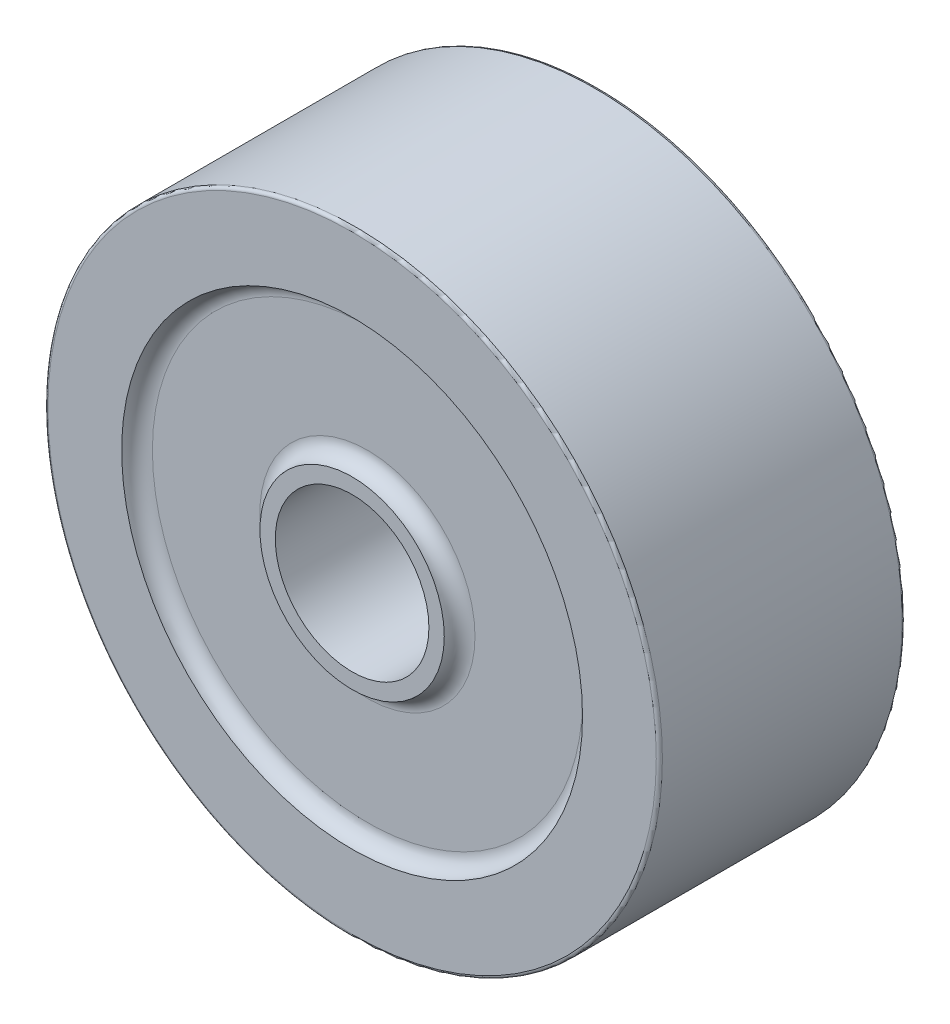
ISO-10303-21;
HEADER;
FILE_DESCRIPTION(('STEP AP214'),'2;1');
FILE_NAME('part.step','',(''),(''),'','','');
FILE_SCHEMA(('AUTOMOTIVE_DESIGN { 1 0 10303 214 1 1 1 1 }'));
ENDSEC;
DATA;
#1=APPLICATION_CONTEXT('core data for automotive mechanical design processes');
#2=APPLICATION_PROTOCOL_DEFINITION('international standard','automotive_design',2000,#1);
#3=PRODUCT_CONTEXT('',#1,'mechanical');
#4=PRODUCT('Part','Part','',(#3));
#5=PRODUCT_RELATED_PRODUCT_CATEGORY('part','',(#4));
#6=PRODUCT_DEFINITION_FORMATION('','',#4);
#7=PRODUCT_DEFINITION_CONTEXT('part definition',#1,'design');
#8=PRODUCT_DEFINITION('design','',#6,#7);
#9=PRODUCT_DEFINITION_SHAPE('','',#8);
#10=(LENGTH_UNIT() NAMED_UNIT(*) SI_UNIT(.MILLI.,.METRE.));
#11=(NAMED_UNIT(*) PLANE_ANGLE_UNIT() SI_UNIT($,.RADIAN.));
#12=(NAMED_UNIT(*) SI_UNIT($,.STERADIAN.) SOLID_ANGLE_UNIT());
#13=UNCERTAINTY_MEASURE_WITH_UNIT(LENGTH_MEASURE(1.E-05),#10,'distance_accuracy_value','');
#14=(GEOMETRIC_REPRESENTATION_CONTEXT(3) GLOBAL_UNCERTAINTY_ASSIGNED_CONTEXT((#13)) GLOBAL_UNIT_ASSIGNED_CONTEXT((#10,
#11,#12)) REPRESENTATION_CONTEXT('',''));
#15=CARTESIAN_POINT('',(0.,0.,0.));
#16=DIRECTION('',(0.,0.,1.));
#17=DIRECTION('',(1.,0.,0.));
#18=AXIS2_PLACEMENT_3D('',#15,#16,#17);
#19=CARTESIAN_POINT('',(0.,0.,0.));
#20=DIRECTION('',(0.,0.,1.));
#21=DIRECTION('',(1.,0.,0.));
#22=AXIS2_PLACEMENT_3D('',#19,#20,#21);
#23=PLANE('',#22);
#24=CARTESIAN_POINT('',(0.,0.,0.));
#25=DIRECTION('',(0.,0.,1.));
#26=DIRECTION('',(1.,0.,0.));
#27=AXIS2_PLACEMENT_3D('',#24,#25,#26);
#28=CIRCLE('',#27,6.35);
#29=CARTESIAN_POINT('',(6.35,0.,0.));
#30=VERTEX_POINT('',#29);
#31=EDGE_CURVE('E127',#30,#30,#28,.T.);
#32=ORIENTED_EDGE('',*,*,#31,.F.);
#33=EDGE_LOOP('',(#32));
#34=FACE_BOUND('',#33,.T.);
#35=CARTESIAN_POINT('',(0.,0.,0.));
#36=DIRECTION('',(0.,0.,1.));
#37=DIRECTION('',(1.,0.,0.));
#38=AXIS2_PLACEMENT_3D('',#35,#36,#37);
#39=CIRCLE('',#38,7.62);
#40=CARTESIAN_POINT('',(7.62,0.,0.));
#41=VERTEX_POINT('',#40);
#42=EDGE_CURVE('E144',#41,#41,#39,.T.);
#43=ORIENTED_EDGE('',*,*,#42,.T.);
#44=EDGE_LOOP('',(#43));
#45=FACE_BOUND('',#44,.T.);
#46=ADVANCED_FACE('F34',(#34,#45),#23,.T.);
#47=CARTESIAN_POINT('',(0.,-7.62,-1.27));
#48=DIRECTION('',(0.,0.,1.));
#49=DIRECTION('',(1.,0.,0.));
#50=AXIS2_PLACEMENT_3D('',#47,#48,#49);
#51=PLANE('',#50);
#52=CARTESIAN_POINT('',(0.,0.,-1.27));
#53=DIRECTION('',(0.,0.,1.));
#54=DIRECTION('',(1.,0.,0.));
#55=AXIS2_PLACEMENT_3D('',#52,#53,#54);
#56=CIRCLE('',#55,8.89);
#57=CARTESIAN_POINT('',(8.89,0.,-1.27));
#58=VERTEX_POINT('',#57);
#59=EDGE_CURVE('E156',#58,#58,#56,.F.);
#60=ORIENTED_EDGE('',*,*,#59,.T.);
#61=EDGE_LOOP('',(#60));
#62=FACE_BOUND('',#61,.T.);
#63=CARTESIAN_POINT('',(0.,0.,-1.27));
#64=DIRECTION('',(0.,0.,1.));
#65=DIRECTION('',(1.,0.,0.));
#66=AXIS2_PLACEMENT_3D('',#63,#64,#65);
#67=CIRCLE('',#66,17.78);
#68=CARTESIAN_POINT('',(17.78,0.,-1.27));
#69=VERTEX_POINT('',#68);
#70=EDGE_CURVE('E153',#69,#69,#67,.T.);
#71=ORIENTED_EDGE('',*,*,#70,.T.);
#72=EDGE_LOOP('',(#71));
#73=FACE_BOUND('',#72,.T.);
#74=ADVANCED_FACE('F184',(#62,#73),#51,.T.);
#75=CARTESIAN_POINT('',(0.,-19.05,0.));
#76=DIRECTION('',(0.,0.,1.));
#77=DIRECTION('',(1.,0.,0.));
#78=AXIS2_PLACEMENT_3D('',#75,#76,#77);
#79=PLANE('',#78);
#80=CARTESIAN_POINT('',(0.,0.,0.));
#81=DIRECTION('',(0.,0.,1.));
#82=DIRECTION('',(1.,0.,0.));
#83=AXIS2_PLACEMENT_3D('',#80,#81,#82);
#84=CIRCLE('',#83,25.146);
#85=CARTESIAN_POINT('',(25.146,0.,0.));
#86=VERTEX_POINT('',#85);
#87=EDGE_CURVE('E159',#86,#86,#84,.T.);
#88=ORIENTED_EDGE('',*,*,#87,.T.);
#89=EDGE_LOOP('',(#88));
#90=FACE_BOUND('',#89,.T.);
#91=CARTESIAN_POINT('',(0.,0.,0.));
#92=DIRECTION('',(0.,0.,1.));
#93=DIRECTION('',(1.,0.,0.));
#94=AXIS2_PLACEMENT_3D('',#91,#92,#93);
#95=CIRCLE('',#94,19.05);
#96=CARTESIAN_POINT('',(19.05,0.,0.));
#97=VERTEX_POINT('',#96);
#98=EDGE_CURVE('E141',#97,#97,#95,.T.);
#99=ORIENTED_EDGE('',*,*,#98,.F.);
#100=EDGE_LOOP('',(#99));
#101=FACE_BOUND('',#100,.T.);
#102=ADVANCED_FACE('F215',(#90,#101),#79,.T.);
#103=CARTESIAN_POINT('',(0.,0.,0.));
#104=DIRECTION('',(0.,0.,1.));
#105=DIRECTION('',(1.,0.,0.));
#106=AXIS2_PLACEMENT_3D('',#103,#104,#105);
#107=CYLINDRICAL_SURFACE('',#106,25.4);
#108=CARTESIAN_POINT('',(0.,0.,-0.254000000000001));
#109=DIRECTION('',(0.,0.,1.));
#110=DIRECTION('',(1.,0.,0.));
#111=AXIS2_PLACEMENT_3D('',#108,#109,#110);
#112=CIRCLE('',#111,25.4);
#113=CARTESIAN_POINT('',(25.4,0.,-0.254000000000001));
#114=VERTEX_POINT('',#113);
#115=EDGE_CURVE('E165',#114,#114,#112,.F.);
#116=ORIENTED_EDGE('',*,*,#115,.T.);
#117=EDGE_LOOP('',(#116));
#118=FACE_BOUND('',#117,.T.);
#119=CARTESIAN_POINT('',(0.,0.,-20.066));
#120=DIRECTION('',(0.,0.,-1.));
#121=DIRECTION('',(-1.,0.,0.));
#122=AXIS2_PLACEMENT_3D('',#119,#120,#121);
#123=CIRCLE('',#122,25.4);
#124=CARTESIAN_POINT('',(-25.4,0.,-20.066));
#125=VERTEX_POINT('',#124);
#126=EDGE_CURVE('E162',#125,#125,#123,.F.);
#127=ORIENTED_EDGE('',*,*,#126,.T.);
#128=EDGE_LOOP('',(#127));
#129=FACE_BOUND('',#128,.T.);
#130=ADVANCED_FACE('F218',(#118,#129),#107,.T.);
#131=CARTESIAN_POINT('',(0.,-19.05,-20.32));
#132=DIRECTION('',(0.,0.,-1.));
#133=DIRECTION('',(-1.,0.,0.));
#134=AXIS2_PLACEMENT_3D('',#131,#132,#133);
#135=PLANE('',#134);
#136=CARTESIAN_POINT('',(0.,0.,-20.32));
#137=DIRECTION('',(0.,0.,-1.));
#138=DIRECTION('',(-1.,0.,0.));
#139=AXIS2_PLACEMENT_3D('',#136,#137,#138);
#140=CIRCLE('',#139,25.146);
#141=CARTESIAN_POINT('',(-25.146,0.,-20.32));
#142=VERTEX_POINT('',#141);
#143=EDGE_CURVE('E167',#142,#142,#140,.T.);
#144=ORIENTED_EDGE('',*,*,#143,.T.);
#145=EDGE_LOOP('',(#144));
#146=FACE_BOUND('',#145,.T.);
#147=CARTESIAN_POINT('',(0.,0.,-20.32));
#148=DIRECTION('',(0.,0.,1.));
#149=DIRECTION('',(1.,0.,0.));
#150=AXIS2_PLACEMENT_3D('',#147,#148,#149);
#151=CIRCLE('',#150,19.05);
#152=CARTESIAN_POINT('',(19.05,0.,-20.32));
#153=VERTEX_POINT('',#152);
#154=EDGE_CURVE('E138',#153,#153,#151,.T.);
#155=ORIENTED_EDGE('',*,*,#154,.T.);
#156=EDGE_LOOP('',(#155));
#157=FACE_BOUND('',#156,.T.);
#158=ADVANCED_FACE('F241',(#146,#157),#135,.T.);
#159=CARTESIAN_POINT('',(0.,-11.4300000000001,-19.05));
#160=DIRECTION('',(0.,0.,-1.));
#161=DIRECTION('',(-1.,0.,0.));
#162=AXIS2_PLACEMENT_3D('',#159,#160,#161);
#163=PLANE('',#162);
#164=CARTESIAN_POINT('',(0.,0.,-19.05));
#165=DIRECTION('',(0.,0.,-1.));
#166=DIRECTION('',(-1.,0.,0.));
#167=AXIS2_PLACEMENT_3D('',#164,#165,#166);
#168=CIRCLE('',#167,12.7000000000001);
#169=CARTESIAN_POINT('',(-12.7000000000001,0.,-19.05));
#170=VERTEX_POINT('',#169);
#171=EDGE_CURVE('E150',#170,#170,#168,.F.);
#172=ORIENTED_EDGE('',*,*,#171,.T.);
#173=EDGE_LOOP('',(#172));
#174=FACE_BOUND('',#173,.T.);
#175=CARTESIAN_POINT('',(0.,0.,-19.05));
#176=DIRECTION('',(0.,0.,-1.));
#177=DIRECTION('',(-1.,0.,0.));
#178=AXIS2_PLACEMENT_3D('',#175,#176,#177);
#179=CIRCLE('',#178,17.78);
#180=CARTESIAN_POINT('',(-17.78,0.,-19.05));
#181=VERTEX_POINT('',#180);
#182=EDGE_CURVE('E147',#181,#181,#179,.T.);
#183=ORIENTED_EDGE('',*,*,#182,.T.);
#184=EDGE_LOOP('',(#183));
#185=FACE_BOUND('',#184,.T.);
#186=ADVANCED_FACE('F238',(#174,#185),#163,.T.);
#187=CARTESIAN_POINT('',(0.,0.,-20.32));
#188=DIRECTION('',(0.,0.,-1.));
#189=DIRECTION('',(-1.,0.,0.));
#190=AXIS2_PLACEMENT_3D('',#187,#188,#189);
#191=PLANE('',#190);
#192=DIRECTION('',(1.,0.,0.));
#193=VECTOR('',#192,1.);
#194=CARTESIAN_POINT('',(6.35,6.35,-20.32));
#195=LINE('',#194,#193);
#196=CARTESIAN_POINT('',(-6.35,6.35,-20.32));
#197=VERTEX_POINT('',#196);
#198=CARTESIAN_POINT('',(6.35,6.35,-20.32));
#199=VERTEX_POINT('',#198);
#200=EDGE_CURVE('E95',#197,#199,#195,.T.);
#201=ORIENTED_EDGE('',*,*,#200,.F.);
#202=DIRECTION('',(0.,1.,0.));
#203=VECTOR('',#202,1.);
#204=CARTESIAN_POINT('',(-6.35,-6.35,-20.32));
#205=LINE('',#204,#203);
#206=CARTESIAN_POINT('',(-6.35,-6.35,-20.32));
#207=VERTEX_POINT('',#206);
#208=EDGE_CURVE('E121',#207,#197,#205,.T.);
#209=ORIENTED_EDGE('',*,*,#208,.F.);
#210=DIRECTION('',(-1.,0.,0.));
#211=VECTOR('',#210,1.);
#212=CARTESIAN_POINT('',(6.35,-6.35,-20.32));
#213=LINE('',#212,#211);
#214=CARTESIAN_POINT('',(6.35,-6.35,-20.32));
#215=VERTEX_POINT('',#214);
#216=EDGE_CURVE('E119',#215,#207,#213,.T.);
#217=ORIENTED_EDGE('',*,*,#216,.F.);
#218=DIRECTION('',(0.,-1.,0.));
#219=VECTOR('',#218,1.);
#220=CARTESIAN_POINT('',(6.35,-6.35,-20.32));
#221=LINE('',#220,#219);
#222=EDGE_CURVE('E101',#199,#215,#221,.T.);
#223=ORIENTED_EDGE('',*,*,#222,.F.);
#224=EDGE_LOOP('',(#201,#209,#217,#223));
#225=FACE_BOUND('',#224,.T.);
#226=CARTESIAN_POINT('',(0.,0.,-20.32));
#227=DIRECTION('',(0.,0.,1.));
#228=DIRECTION('',(1.,0.,0.));
#229=AXIS2_PLACEMENT_3D('',#226,#227,#228);
#230=CIRCLE('',#229,11.4300000000001);
#231=CARTESIAN_POINT('',(11.4300000000001,0.,-20.32));
#232=VERTEX_POINT('',#231);
#233=EDGE_CURVE('E135',#232,#232,#230,.T.);
#234=ORIENTED_EDGE('',*,*,#233,.F.);
#235=EDGE_LOOP('',(#234));
#236=FACE_BOUND('',#235,.T.);
#237=ADVANCED_FACE('F178',(#225,#236),#191,.T.);
#238=CARTESIAN_POINT('',(0.,0.,-20.32));
#239=DIRECTION('',(0.,0.,1.));
#240=DIRECTION('',(1.,0.,0.));
#241=AXIS2_PLACEMENT_3D('',#238,#239,#240);
#242=CYLINDRICAL_SURFACE('',#241,6.35);
#243=CARTESIAN_POINT('',(0.,0.,-15.24));
#244=DIRECTION('',(0.,0.,1.));
#245=DIRECTION('',(1.,0.,0.));
#246=AXIS2_PLACEMENT_3D('',#243,#244,#245);
#247=CIRCLE('',#246,6.35);
#248=CARTESIAN_POINT('',(0.,6.35,-15.24));
#249=VERTEX_POINT('',#248);
#250=CARTESIAN_POINT('',(6.35,0.,-15.24));
#251=VERTEX_POINT('',#250);
#252=EDGE_CURVE('E38',#249,#251,#247,.F.);
#253=ORIENTED_EDGE('',*,*,#252,.T.);
#254=CARTESIAN_POINT('',(0.,-6.35,-15.24));
#255=VERTEX_POINT('',#254);
#256=EDGE_CURVE('E11',#251,#255,#247,.F.);
#257=ORIENTED_EDGE('',*,*,#256,.T.);
#258=CARTESIAN_POINT('',(-6.35,0.,-15.24));
#259=VERTEX_POINT('',#258);
#260=EDGE_CURVE('E43',#255,#259,#247,.F.);
#261=ORIENTED_EDGE('',*,*,#260,.T.);
#262=EDGE_CURVE('E171',#259,#249,#247,.F.);
#263=ORIENTED_EDGE('',*,*,#262,.T.);
#264=EDGE_LOOP('',(#253,#257,#261,#263));
#265=FACE_BOUND('',#264,.T.);
#266=ORIENTED_EDGE('',*,*,#31,.T.);
#267=EDGE_LOOP('',(#266));
#268=FACE_BOUND('',#267,.T.);
#269=ADVANCED_FACE('F174',(#265,#268),#242,.F.);
#270=CARTESIAN_POINT('',(0.,0.,-20.32));
#271=DIRECTION('',(0.,0.,-1.));
#272=DIRECTION('',(-1.,0.,0.));
#273=AXIS2_PLACEMENT_3D('',#270,#271,#272);
#274=TOROIDAL_SURFACE('',#273,12.7000000000001,1.27);
#275=ORIENTED_EDGE('',*,*,#233,.T.);
#276=EDGE_LOOP('',(#275));
#277=FACE_BOUND('',#276,.T.);
#278=ORIENTED_EDGE('',*,*,#171,.F.);
#279=EDGE_LOOP('',(#278));
#280=FACE_BOUND('',#279,.T.);
#281=ADVANCED_FACE('F177',(#277,#280),#274,.F.);
#282=CARTESIAN_POINT('',(0.,0.,-20.32));
#283=DIRECTION('',(0.,0.,-1.));
#284=DIRECTION('',(-1.,0.,0.));
#285=AXIS2_PLACEMENT_3D('',#282,#283,#284);
#286=TOROIDAL_SURFACE('',#285,17.78,1.27);
#287=ORIENTED_EDGE('',*,*,#182,.F.);
#288=EDGE_LOOP('',(#287));
#289=FACE_BOUND('',#288,.T.);
#290=ORIENTED_EDGE('',*,*,#154,.F.);
#291=EDGE_LOOP('',(#290));
#292=FACE_BOUND('',#291,.T.);
#293=ADVANCED_FACE('F191',(#289,#292),#286,.F.);
#294=CARTESIAN_POINT('',(0.,0.,0.));
#295=DIRECTION('',(0.,0.,1.));
#296=DIRECTION('',(1.,0.,0.));
#297=AXIS2_PLACEMENT_3D('',#294,#295,#296);
#298=TOROIDAL_SURFACE('',#297,8.89,1.27);
#299=ORIENTED_EDGE('',*,*,#59,.F.);
#300=EDGE_LOOP('',(#299));
#301=FACE_BOUND('',#300,.T.);
#302=ORIENTED_EDGE('',*,*,#42,.F.);
#303=EDGE_LOOP('',(#302));
#304=FACE_BOUND('',#303,.T.);
#305=ADVANCED_FACE('F188',(#301,#304),#298,.F.);
#306=CARTESIAN_POINT('',(0.,0.,0.));
#307=DIRECTION('',(0.,0.,1.));
#308=DIRECTION('',(1.,0.,0.));
#309=AXIS2_PLACEMENT_3D('',#306,#307,#308);
#310=TOROIDAL_SURFACE('',#309,17.78,1.27);
#311=ORIENTED_EDGE('',*,*,#98,.T.);
#312=EDGE_LOOP('',(#311));
#313=FACE_BOUND('',#312,.T.);
#314=ORIENTED_EDGE('',*,*,#70,.F.);
#315=EDGE_LOOP('',(#314));
#316=FACE_BOUND('',#315,.T.);
#317=ADVANCED_FACE('F190',(#313,#316),#310,.F.);
#318=CARTESIAN_POINT('',(0.,0.,-0.254000000000001));
#319=DIRECTION('',(0.,0.,1.));
#320=DIRECTION('',(1.,0.,0.));
#321=AXIS2_PLACEMENT_3D('',#318,#319,#320);
#322=TOROIDAL_SURFACE('',#321,25.146,0.254);
#323=ORIENTED_EDGE('',*,*,#115,.F.);
#324=EDGE_LOOP('',(#323));
#325=FACE_BOUND('',#324,.T.);
#326=ORIENTED_EDGE('',*,*,#87,.F.);
#327=EDGE_LOOP('',(#326));
#328=FACE_BOUND('',#327,.T.);
#329=ADVANCED_FACE('F198',(#325,#328),#322,.T.);
#330=CARTESIAN_POINT('',(0.,0.,-20.066));
#331=DIRECTION('',(0.,0.,-1.));
#332=DIRECTION('',(-1.,0.,0.));
#333=AXIS2_PLACEMENT_3D('',#330,#331,#332);
#334=TOROIDAL_SURFACE('',#333,25.146,0.254);
#335=ORIENTED_EDGE('',*,*,#143,.F.);
#336=EDGE_LOOP('',(#335));
#337=FACE_BOUND('',#336,.T.);
#338=ORIENTED_EDGE('',*,*,#126,.F.);
#339=EDGE_LOOP('',(#338));
#340=FACE_BOUND('',#339,.T.);
#341=ADVANCED_FACE('F36',(#337,#340),#334,.T.);
#342=CARTESIAN_POINT('',(6.35,-6.35,-15.24));
#343=DIRECTION('',(1.,0.,0.));
#344=DIRECTION('',(0.,0.,-1.));
#345=AXIS2_PLACEMENT_3D('',#342,#343,#344);
#346=PLANE('',#345);
#347=DIRECTION('',(0.,-1.,0.));
#348=VECTOR('',#347,1.);
#349=CARTESIAN_POINT('',(6.35,-6.35,-15.24));
#350=LINE('',#349,#348);
#351=CARTESIAN_POINT('',(6.35,6.35,-15.24));
#352=VERTEX_POINT('',#351);
#353=EDGE_CURVE('E50',#352,#251,#350,.T.);
#354=ORIENTED_EDGE('',*,*,#353,.F.);
#355=DIRECTION('',(0.,0.,-1.));
#356=VECTOR('',#355,1.);
#357=CARTESIAN_POINT('',(6.35,6.35,-15.24));
#358=LINE('',#357,#356);
#359=EDGE_CURVE('E125',#352,#199,#358,.T.);
#360=ORIENTED_EDGE('',*,*,#359,.T.);
#361=ORIENTED_EDGE('',*,*,#222,.T.);
#362=DIRECTION('',(0.,0.,-1.));
#363=VECTOR('',#362,1.);
#364=CARTESIAN_POINT('',(6.35,-6.35,-15.24));
#365=LINE('',#364,#363);
#366=CARTESIAN_POINT('',(6.35,-6.35,-15.24));
#367=VERTEX_POINT('',#366);
#368=EDGE_CURVE('E98',#367,#215,#365,.T.);
#369=ORIENTED_EDGE('',*,*,#368,.F.);
#370=EDGE_CURVE('E88',#251,#367,#350,.T.);
#371=ORIENTED_EDGE('',*,*,#370,.F.);
#372=EDGE_LOOP('',(#354,#360,#361,#369,#371));
#373=FACE_BOUND('',#372,.T.);
#374=ADVANCED_FACE('F99',(#373),#346,.F.);
#375=CARTESIAN_POINT('',(6.35,6.35,-15.24));
#376=DIRECTION('',(0.,1.,0.));
#377=DIRECTION('',(0.,0.,1.));
#378=AXIS2_PLACEMENT_3D('',#375,#376,#377);
#379=PLANE('',#378);
#380=DIRECTION('',(1.,0.,0.));
#381=VECTOR('',#380,1.);
#382=CARTESIAN_POINT('',(6.35,6.35,-15.24));
#383=LINE('',#382,#381);
#384=CARTESIAN_POINT('',(-6.35,6.35,-15.24));
#385=VERTEX_POINT('',#384);
#386=EDGE_CURVE('E105',#385,#249,#383,.T.);
#387=ORIENTED_EDGE('',*,*,#386,.F.);
#388=DIRECTION('',(0.,0.,-1.));
#389=VECTOR('',#388,1.);
#390=CARTESIAN_POINT('',(-6.35,6.35,-15.24));
#391=LINE('',#390,#389);
#392=EDGE_CURVE('E128',#385,#197,#391,.T.);
#393=ORIENTED_EDGE('',*,*,#392,.T.);
#394=ORIENTED_EDGE('',*,*,#200,.T.);
#395=ORIENTED_EDGE('',*,*,#359,.F.);
#396=EDGE_CURVE('E115',#249,#352,#383,.T.);
#397=ORIENTED_EDGE('',*,*,#396,.F.);
#398=EDGE_LOOP('',(#387,#393,#394,#395,#397));
#399=FACE_BOUND('',#398,.T.);
#400=ADVANCED_FACE('F259',(#399),#379,.F.);
#401=CARTESIAN_POINT('',(-6.35,-6.35,-15.24));
#402=DIRECTION('',(-1.,0.,0.));
#403=DIRECTION('',(0.,0.,1.));
#404=AXIS2_PLACEMENT_3D('',#401,#402,#403);
#405=PLANE('',#404);
#406=DIRECTION('',(0.,1.,0.));
#407=VECTOR('',#406,1.);
#408=CARTESIAN_POINT('',(-6.35,-6.35,-15.24));
#409=LINE('',#408,#407);
#410=CARTESIAN_POINT('',(-6.35,-6.35,-15.24));
#411=VERTEX_POINT('',#410);
#412=EDGE_CURVE('E112',#411,#259,#409,.T.);
#413=ORIENTED_EDGE('',*,*,#412,.F.);
#414=DIRECTION('',(0.,0.,-1.));
#415=VECTOR('',#414,1.);
#416=CARTESIAN_POINT('',(-6.35,-6.35,-15.24));
#417=LINE('',#416,#415);
#418=EDGE_CURVE('E104',#411,#207,#417,.T.);
#419=ORIENTED_EDGE('',*,*,#418,.T.);
#420=ORIENTED_EDGE('',*,*,#208,.T.);
#421=ORIENTED_EDGE('',*,*,#392,.F.);
#422=EDGE_CURVE('E110',#259,#385,#409,.T.);
#423=ORIENTED_EDGE('',*,*,#422,.F.);
#424=EDGE_LOOP('',(#413,#419,#420,#421,#423));
#425=FACE_BOUND('',#424,.T.);
#426=ADVANCED_FACE('F262',(#425),#405,.F.);
#427=CARTESIAN_POINT('',(6.35,-6.35,-15.24));
#428=DIRECTION('',(0.,-1.,0.));
#429=DIRECTION('',(0.,0.,-1.));
#430=AXIS2_PLACEMENT_3D('',#427,#428,#429);
#431=PLANE('',#430);
#432=DIRECTION('',(-1.,0.,0.));
#433=VECTOR('',#432,1.);
#434=CARTESIAN_POINT('',(6.35,-6.35,-15.24));
#435=LINE('',#434,#433);
#436=EDGE_CURVE('E92',#367,#255,#435,.T.);
#437=ORIENTED_EDGE('',*,*,#436,.F.);
#438=ORIENTED_EDGE('',*,*,#368,.T.);
#439=ORIENTED_EDGE('',*,*,#216,.T.);
#440=ORIENTED_EDGE('',*,*,#418,.F.);
#441=EDGE_CURVE('E109',#255,#411,#435,.T.);
#442=ORIENTED_EDGE('',*,*,#441,.F.);
#443=EDGE_LOOP('',(#437,#438,#439,#440,#442));
#444=FACE_BOUND('',#443,.T.);
#445=ADVANCED_FACE('F107',(#444),#431,.F.);
#446=CARTESIAN_POINT('',(0.,0.,-15.24));
#447=DIRECTION('',(0.,0.,1.));
#448=DIRECTION('',(1.,0.,0.));
#449=AXIS2_PLACEMENT_3D('',#446,#447,#448);
#450=PLANE('',#449);
#451=ORIENTED_EDGE('',*,*,#370,.T.);
#452=ORIENTED_EDGE('',*,*,#436,.T.);
#453=ORIENTED_EDGE('',*,*,#256,.F.);
#454=EDGE_LOOP('',(#451,#452,#453));
#455=FACE_BOUND('',#454,.T.);
#456=ADVANCED_FACE('F90',(#455),#450,.F.);
#457=ORIENTED_EDGE('',*,*,#441,.T.);
#458=ORIENTED_EDGE('',*,*,#412,.T.);
#459=ORIENTED_EDGE('',*,*,#260,.F.);
#460=EDGE_LOOP('',(#457,#458,#459));
#461=FACE_BOUND('',#460,.T.);
#462=ADVANCED_FACE('F270',(#461),#450,.F.);
#463=ORIENTED_EDGE('',*,*,#422,.T.);
#464=ORIENTED_EDGE('',*,*,#386,.T.);
#465=ORIENTED_EDGE('',*,*,#262,.F.);
#466=EDGE_LOOP('',(#463,#464,#465));
#467=FACE_BOUND('',#466,.T.);
#468=ADVANCED_FACE('F275',(#467),#450,.F.);
#469=ORIENTED_EDGE('',*,*,#396,.T.);
#470=ORIENTED_EDGE('',*,*,#353,.T.);
#471=ORIENTED_EDGE('',*,*,#252,.F.);
#472=EDGE_LOOP('',(#469,#470,#471));
#473=FACE_BOUND('',#472,.T.);
#474=ADVANCED_FACE('F271',(#473),#450,.F.);
#475=CLOSED_SHELL('',(#46,#74,#102,#130,#158,#186,#237,#269,#281,#293,#305,#317,#329,#341,#374,
#400,#426,#445,#456,#462,#468,#474));
#476=MANIFOLD_SOLID_BREP('B2',#475);
#477=ADVANCED_BREP_SHAPE_REPRESENTATION('',(#18,#476),#14);
#478=SHAPE_DEFINITION_REPRESENTATION(#9,#477);
ENDSEC;
END-ISO-10303-21;
